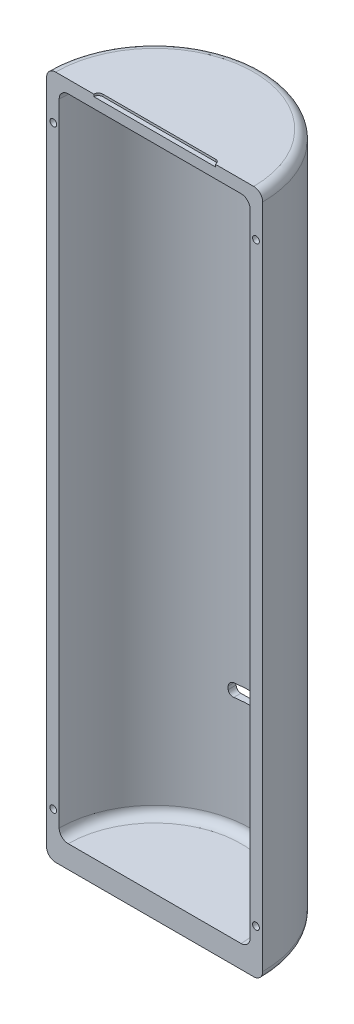
ISO-10303-21;
HEADER;
FILE_DESCRIPTION(('STEP AP214'),'2;1');
FILE_NAME('part.step','',(''),(''),'','','');
FILE_SCHEMA(('AUTOMOTIVE_DESIGN { 1 0 10303 214 1 1 1 1 }'));
ENDSEC;
DATA;
#1=APPLICATION_CONTEXT('core data for automotive mechanical design processes');
#2=APPLICATION_PROTOCOL_DEFINITION('international standard','automotive_design',2000,#1);
#3=PRODUCT_CONTEXT('',#1,'mechanical');
#4=PRODUCT('Part','Part','',(#3));
#5=PRODUCT_RELATED_PRODUCT_CATEGORY('part','',(#4));
#6=PRODUCT_DEFINITION_FORMATION('','',#4);
#7=PRODUCT_DEFINITION_CONTEXT('part definition',#1,'design');
#8=PRODUCT_DEFINITION('design','',#6,#7);
#9=PRODUCT_DEFINITION_SHAPE('','',#8);
#10=(LENGTH_UNIT() NAMED_UNIT(*) SI_UNIT(.MILLI.,.METRE.));
#11=(NAMED_UNIT(*) PLANE_ANGLE_UNIT() SI_UNIT($,.RADIAN.));
#12=(NAMED_UNIT(*) SI_UNIT($,.STERADIAN.) SOLID_ANGLE_UNIT());
#13=UNCERTAINTY_MEASURE_WITH_UNIT(LENGTH_MEASURE(1.E-05),#10,'distance_accuracy_value','');
#14=(GEOMETRIC_REPRESENTATION_CONTEXT(3) GLOBAL_UNCERTAINTY_ASSIGNED_CONTEXT((#13)) GLOBAL_UNIT_ASSIGNED_CONTEXT((#10,
#11,#12)) REPRESENTATION_CONTEXT('',''));
#15=CARTESIAN_POINT('',(0.,0.,0.));
#16=DIRECTION('',(0.,0.,1.));
#17=DIRECTION('',(1.,0.,0.));
#18=AXIS2_PLACEMENT_3D('',#15,#16,#17);
#19=CARTESIAN_POINT('',(0.,152.,0.));
#20=DIRECTION('',(0.,-1.,0.));
#21=DIRECTION('',(0.,0.,-1.));
#22=AXIS2_PLACEMENT_3D('',#19,#20,#21);
#23=CYLINDRICAL_SURFACE('',#22,21.2);
#24=CARTESIAN_POINT('',(-4.4,32.35,-20.7383702349052));
#25=CARTESIAN_POINT('',(-4.4000001515096,32.379107600653,-20.7383698433978));
#26=CARTESIAN_POINT('',(-4.3987888565949,32.408201053021,-20.7386272390488));
#27=CARTESIAN_POINT('',(-4.3939588193553,32.4661754495899,-20.7396512728291));
#28=CARTESIAN_POINT('',(-4.3903403202981,32.4950564149664,-20.7404178595004));
#29=CARTESIAN_POINT('',(-4.3759192589122,32.5809794161951,-20.743467242474));
#30=CARTESIAN_POINT('',(-4.36155096422142,32.6374389453209,-20.7464997241652));
#31=CARTESIAN_POINT('',(-4.32375391654669,32.7470787921054,-20.7544096529308));
#32=CARTESIAN_POINT('',(-4.30032314504044,32.8002583761468,-20.759287511028));
#33=CARTESIAN_POINT('',(-4.2451186797055,32.9019115053798,-20.7706465618117));
#34=CARTESIAN_POINT('',(-4.2133447143213,32.9503848973232,-20.7771278066851));
#35=CARTESIAN_POINT('',(-4.14200532283936,33.041828961603,-20.7914676209067));
#36=CARTESIAN_POINT('',(-4.1023598621572,33.0847349256314,-20.7993402384933));
#37=CARTESIAN_POINT('',(-4.01662488599776,33.163322658802,-20.8160666039073));
#38=CARTESIAN_POINT('',(-3.97053375340399,33.1990026095359,-20.8249205978304));
#39=CARTESIAN_POINT('',(-3.87223146361336,33.2628398865507,-20.8434251165478));
#40=CARTESIAN_POINT('',(-3.81991817223142,33.2908362939988,-20.8530878403309));
#41=CARTESIAN_POINT('',(-3.71138198358165,33.3376190603292,-20.8726777964638));
#42=CARTESIAN_POINT('',(-3.65516079878495,33.3564094246828,-20.8826049117933));
#43=CARTESIAN_POINT('',(-3.55725550918452,33.3801877944643,-20.8994647172685));
#44=CARTESIAN_POINT('',(-3.51614906333593,33.3876083389167,-20.9064209319152));
#45=CARTESIAN_POINT('',(-3.43337425294976,33.3975147053391,-20.9201749805508));
#46=CARTESIAN_POINT('',(-3.39170666478906,33.4000067561618,-20.9269730037113));
#47=CARTESIAN_POINT('',(-3.35,33.4,-20.9336451675288));
#48=B_SPLINE_CURVE_WITH_KNOTS('',3,(#24,#25,#26,#27,#28,#29,#30,#31,#32,#33,#34,#35,#36,#37,#38,
#39,#40,#41,#42,#43,#44,#45,#46,#47),.UNSPECIFIED.,.F.,.F.,(4,2,2,2,2,2,2,2,2,2,2,4),(0.,
0.0872684818234315,0.174528145791605,0.348640619584171,0.522791896509528,0.696948842439431,
0.872976707941943,1.04904881552733,1.22856736866758,1.40800774528996,1.53477000707225,
1.66137195834209),.UNSPECIFIED.);
#49=CARTESIAN_POINT('',(-4.4,32.35,-20.7383702349052));
#50=VERTEX_POINT('',#49);
#51=CARTESIAN_POINT('',(-3.35,33.4,-20.9336451675288));
#52=VERTEX_POINT('',#51);
#53=EDGE_CURVE('E785',#50,#52,#48,.T.);
#54=ORIENTED_EDGE('',*,*,#53,.T.);
#55=CARTESIAN_POINT('',(0.,33.4,0.));
#56=DIRECTION('',(0.,1.,0.));
#57=DIRECTION('',(0.,0.,1.));
#58=AXIS2_PLACEMENT_3D('',#55,#56,#57);
#59=CIRCLE('',#58,21.2);
#60=CARTESIAN_POINT('',(3.35,33.4,-20.9336451675288));
#61=VERTEX_POINT('',#60);
#62=EDGE_CURVE('E394',#52,#61,#59,.F.);
#63=ORIENTED_EDGE('',*,*,#62,.T.);
#64=CARTESIAN_POINT('',(3.35,33.4,-20.9336451675288));
#65=CARTESIAN_POINT('',(3.37995160542955,33.3999996171922,-20.9288523968009));
#66=CARTESIAN_POINT('',(3.40987811653389,33.3987176775791,-20.9239968936497));
#67=CARTESIAN_POINT('',(3.46949591392431,33.3936075736858,-20.9141939485621));
#68=CARTESIAN_POINT('',(3.49918721440298,33.3897795642378,-20.9092465122341));
#69=CARTESIAN_POINT('',(3.58755078993113,33.3745162887233,-20.8943301248397));
#70=CARTESIAN_POINT('',(3.64560061748393,33.3593016663017,-20.8842730100985));
#71=CARTESIAN_POINT('',(3.75828473099165,33.3192193523011,-20.8642896209136));
#72=CARTESIAN_POINT('',(3.81291756354137,33.2943475850813,-20.8543634035441));
#73=CARTESIAN_POINT('',(3.91722424166481,33.2356272404759,-20.8350226280058));
#74=CARTESIAN_POINT('',(3.96689899652127,33.2017803132615,-20.8256079761637));
#75=CARTESIAN_POINT('',(4.05975464935551,33.1260987104448,-20.8077059831843));
#76=CARTESIAN_POINT('',(4.10294883056208,33.0842807840545,-20.7992167552551));
#77=CARTESIAN_POINT('',(4.18168253527464,32.993740781101,-20.7835306664113));
#78=CARTESIAN_POINT('',(4.2172209927563,32.9450177445968,-20.7763339855011));
#79=CARTESIAN_POINT('',(4.27906635037108,32.8428023140441,-20.7636840871812));
#80=CARTESIAN_POINT('',(4.30549917346799,32.7893889711621,-20.7582071892381));
#81=CARTESIAN_POINT('',(4.34897680699255,32.6787410004115,-20.7491421067053));
#82=CARTESIAN_POINT('',(4.36602987099571,32.6215097819157,-20.7455522617558));
#83=CARTESIAN_POINT('',(4.38539018518352,32.5281928748702,-20.7414658703578));
#84=CARTESIAN_POINT('',(4.39086525883165,32.4927624224329,-20.7403067839611));
#85=CARTESIAN_POINT('',(4.39816938468507,32.4215603669354,-20.7387586603825));
#86=CARTESIAN_POINT('',(4.40000342917201,32.3857892986574,-20.738368568823));
#87=CARTESIAN_POINT('',(4.4,32.35,-20.7383702349052));
#88=B_SPLINE_CURVE_WITH_KNOTS('',3,(#64,#65,#66,#67,#68,#69,#70,#71,#72,#73,#74,#75,#76,#77,#78,
#79,#80,#81,#82,#83,#84,#85,#86,#87),.UNSPECIFIED.,.F.,.F.,(4,2,2,2,2,2,2,2,2,2,2,4),(0.,
0.0909414579116239,0.181877385978352,0.36348563802479,0.545170618331823,0.726822217204737,
0.908096243109193,1.08939549429618,1.2680761318598,1.44659928956934,1.55403000558249,
1.66131331936211),.UNSPECIFIED.);
#89=CARTESIAN_POINT('',(4.4,32.35,-20.7383702349052));
#90=VERTEX_POINT('',#89);
#91=EDGE_CURVE('E227',#61,#90,#88,.T.);
#92=ORIENTED_EDGE('',*,*,#91,.T.);
#93=DIRECTION('',(0.,-1.,0.));
#94=VECTOR('',#93,1.);
#95=CARTESIAN_POINT('',(4.39999999999999,152.,-20.7383702349052));
#96=LINE('',#95,#94);
#97=CARTESIAN_POINT('',(4.39999999999999,31.65,-20.7383702349052));
#98=VERTEX_POINT('',#97);
#99=EDGE_CURVE('E237',#90,#98,#96,.T.);
#100=ORIENTED_EDGE('',*,*,#99,.T.);
#101=CARTESIAN_POINT('',(4.4,31.65,-20.7383702349052));
#102=CARTESIAN_POINT('',(4.40000015150959,31.620892399347,-20.7383698433978));
#103=CARTESIAN_POINT('',(4.39878885659489,31.591798946979,-20.7386272390488));
#104=CARTESIAN_POINT('',(4.39395881935529,31.5338245504101,-20.7396512728291));
#105=CARTESIAN_POINT('',(4.39034032029809,31.5049435850336,-20.7404178595004));
#106=CARTESIAN_POINT('',(4.37591925891219,31.4190205838049,-20.743467242474));
#107=CARTESIAN_POINT('',(4.36155096422141,31.3625610546791,-20.7464997241653));
#108=CARTESIAN_POINT('',(4.32375391654668,31.2529212078946,-20.7544096529308));
#109=CARTESIAN_POINT('',(4.30032314504043,31.1997416238532,-20.759287511028));
#110=CARTESIAN_POINT('',(4.2451186797055,31.0980884946202,-20.7706465618117));
#111=CARTESIAN_POINT('',(4.2133447143213,31.0496151026768,-20.7771278066851));
#112=CARTESIAN_POINT('',(4.14200532283935,30.958171038397,-20.7914676209068));
#113=CARTESIAN_POINT('',(4.1023598621572,30.9152650743686,-20.7993402384933));
#114=CARTESIAN_POINT('',(4.01662488599776,30.836677341198,-20.8160666039073));
#115=CARTESIAN_POINT('',(3.97053375340399,30.8009973904641,-20.8249205978304));
#116=CARTESIAN_POINT('',(3.87223146361335,30.7371601134493,-20.8434251165478));
#117=CARTESIAN_POINT('',(3.81991817223141,30.7091637060012,-20.8530878403309));
#118=CARTESIAN_POINT('',(3.71138198358164,30.6623809396708,-20.8726777964638));
#119=CARTESIAN_POINT('',(3.65516079878495,30.6435905753172,-20.8826049117933));
#120=CARTESIAN_POINT('',(3.55725550918452,30.6198122055357,-20.8994647172685));
#121=CARTESIAN_POINT('',(3.51614906333593,30.6123916610833,-20.9064209319152));
#122=CARTESIAN_POINT('',(3.43337425294976,30.6024852946609,-20.9201749805508));
#123=CARTESIAN_POINT('',(3.39170666478906,30.5999932438382,-20.9269730037113));
#124=CARTESIAN_POINT('',(3.35,30.6,-20.9336451675288));
#125=B_SPLINE_CURVE_WITH_KNOTS('',3,(#101,#102,#103,#104,#105,#106,#107,#108,#109,#110,#111,
#112,#113,#114,#115,#116,#117,#118,#119,#120,#121,#122,#123,#124),.UNSPECIFIED.,.F.,.F.,(4,2,2,
2,2,2,2,2,2,2,2,4),(0.,0.0872684818234315,0.174528145791606,0.348640619584171,0.522791896509523,
0.696948842439424,0.872976707941937,1.04904881552733,1.22856736866758,1.40800774528996,
1.53477000707225,1.66137195834209),.UNSPECIFIED.);
#126=CARTESIAN_POINT('',(3.35,30.6,-20.9336451675288));
#127=VERTEX_POINT('',#126);
#128=EDGE_CURVE('E254',#98,#127,#125,.T.);
#129=ORIENTED_EDGE('',*,*,#128,.T.);
#130=CARTESIAN_POINT('',(0.,30.6,0.));
#131=DIRECTION('',(0.,-1.,0.));
#132=DIRECTION('',(0.,0.,-1.));
#133=AXIS2_PLACEMENT_3D('',#130,#131,#132);
#134=CIRCLE('',#133,21.2);
#135=CARTESIAN_POINT('',(-3.35,30.6,-20.9336451675288));
#136=VERTEX_POINT('',#135);
#137=EDGE_CURVE('E271',#127,#136,#134,.F.);
#138=ORIENTED_EDGE('',*,*,#137,.T.);
#139=CARTESIAN_POINT('',(-3.35,30.6,-20.9336451675288));
#140=CARTESIAN_POINT('',(-3.37995160542955,30.6000003828078,-20.9288523968009));
#141=CARTESIAN_POINT('',(-3.40987811653389,30.6012823224209,-20.9239968936497));
#142=CARTESIAN_POINT('',(-3.46949591392432,30.6063924263142,-20.9141939485621));
#143=CARTESIAN_POINT('',(-3.49918721440298,30.6102204357622,-20.9092465122341));
#144=CARTESIAN_POINT('',(-3.58755078993114,30.6254837112767,-20.8943301248397));
#145=CARTESIAN_POINT('',(-3.64560061748394,30.6406983336983,-20.8842730100985));
#146=CARTESIAN_POINT('',(-3.75828473099166,30.6807806476989,-20.8642896209136));
#147=CARTESIAN_POINT('',(-3.81291756354138,30.7056524149187,-20.8543634035441));
#148=CARTESIAN_POINT('',(-3.91722424166481,30.7643727595241,-20.8350226280058));
#149=CARTESIAN_POINT('',(-3.96689899652128,30.7982196867385,-20.8256079761637));
#150=CARTESIAN_POINT('',(-4.05975464935551,30.8739012895553,-20.8077059831843));
#151=CARTESIAN_POINT('',(-4.10294883056208,30.9157192159455,-20.7992167552551));
#152=CARTESIAN_POINT('',(-4.18168253527465,31.006259218899,-20.7835306664113));
#153=CARTESIAN_POINT('',(-4.21722099275631,31.0549822554032,-20.7763339855011));
#154=CARTESIAN_POINT('',(-4.27906635037109,31.1571976859559,-20.7636840871812));
#155=CARTESIAN_POINT('',(-4.305499173468,31.2106110288379,-20.7582071892381));
#156=CARTESIAN_POINT('',(-4.34897680699256,31.3212589995885,-20.7491421067053));
#157=CARTESIAN_POINT('',(-4.36602987099572,31.3784902180844,-20.7455522617558));
#158=CARTESIAN_POINT('',(-4.38539018518353,31.4718071251298,-20.7414658703578));
#159=CARTESIAN_POINT('',(-4.39086525883166,31.5072375775671,-20.7403067839611));
#160=CARTESIAN_POINT('',(-4.39816938468507,31.5784396330646,-20.7387586603825));
#161=CARTESIAN_POINT('',(-4.40000342917201,31.6142107013426,-20.738368568823));
#162=CARTESIAN_POINT('',(-4.4,31.65,-20.7383702349052));
#163=B_SPLINE_CURVE_WITH_KNOTS('',3,(#139,#140,#141,#142,#143,#144,#145,#146,#147,#148,#149,
#150,#151,#152,#153,#154,#155,#156,#157,#158,#159,#160,#161,#162),.UNSPECIFIED.,.F.,.F.,(4,2,2,
2,2,2,2,2,2,2,2,4),(0.,0.0909414579116234,0.181877385978351,0.363485638024791,0.545170618331821,
0.726822217204738,0.908096243109195,1.08939549429618,1.2680761318598,1.44659928956935,
1.55403000558249,1.66131331936211),.UNSPECIFIED.);
#164=CARTESIAN_POINT('',(-4.4,31.65,-20.7383702349052));
#165=VERTEX_POINT('',#164);
#166=EDGE_CURVE('E262',#136,#165,#163,.T.);
#167=ORIENTED_EDGE('',*,*,#166,.T.);
#168=DIRECTION('',(0.,-1.,0.));
#169=VECTOR('',#168,1.);
#170=CARTESIAN_POINT('',(-4.4,152.,-20.7383702349052));
#171=LINE('',#170,#169);
#172=EDGE_CURVE('E270',#165,#50,#171,.F.);
#173=ORIENTED_EDGE('',*,*,#172,.T.);
#174=EDGE_LOOP('',(#54,#63,#92,#100,#129,#138,#167,#173));
#175=FACE_BOUND('',#174,.T.);
#176=DIRECTION('',(0.,-1.,0.));
#177=VECTOR('',#176,1.);
#178=CARTESIAN_POINT('',(21.2,152.,0.));
#179=LINE('',#178,#177);
#180=CARTESIAN_POINT('',(21.2,147.2,0.));
#181=VERTEX_POINT('',#180);
#182=CARTESIAN_POINT('',(21.2,7.00000000000001,0.));
#183=VERTEX_POINT('',#182);
#184=EDGE_CURVE('E413',#181,#183,#179,.T.);
#185=ORIENTED_EDGE('',*,*,#184,.F.);
#186=CARTESIAN_POINT('',(0.,147.2,0.));
#187=DIRECTION('',(0.,1.,0.));
#188=DIRECTION('',(0.,0.,1.));
#189=AXIS2_PLACEMENT_3D('',#186,#187,#188);
#190=CIRCLE('',#189,21.2);
#191=CARTESIAN_POINT('',(-21.2,147.2,0.));
#192=VERTEX_POINT('',#191);
#193=EDGE_CURVE('E341',#181,#192,#190,.T.);
#194=ORIENTED_EDGE('',*,*,#193,.T.);
#195=DIRECTION('',(0.,-1.,0.));
#196=VECTOR('',#195,1.);
#197=CARTESIAN_POINT('',(-21.2,152.,0.));
#198=LINE('',#197,#196);
#199=CARTESIAN_POINT('',(-21.2,7.00000000000001,0.));
#200=VERTEX_POINT('',#199);
#201=EDGE_CURVE('E421',#200,#192,#198,.F.);
#202=ORIENTED_EDGE('',*,*,#201,.F.);
#203=CARTESIAN_POINT('',(0.,7.00000000000001,0.));
#204=DIRECTION('',(0.,1.,0.));
#205=DIRECTION('',(0.,0.,1.));
#206=AXIS2_PLACEMENT_3D('',#203,#204,#205);
#207=CIRCLE('',#206,21.2);
#208=EDGE_CURVE('E332',#200,#183,#207,.F.);
#209=ORIENTED_EDGE('',*,*,#208,.T.);
#210=EDGE_LOOP('',(#185,#194,#202,#209));
#211=FACE_BOUND('',#210,.T.);
#212=ADVANCED_FACE('F38',(#175,#211),#23,.F.);
#213=CARTESIAN_POINT('',(0.,149.2,0.));
#214=DIRECTION('',(0.,1.,0.));
#215=DIRECTION('',(0.,0.,1.));
#216=AXIS2_PLACEMENT_3D('',#213,#214,#215);
#217=PLANE('',#216);
#218=CARTESIAN_POINT('',(0.,149.2,0.));
#219=DIRECTION('',(0.,1.,0.));
#220=DIRECTION('',(0.,0.,1.));
#221=AXIS2_PLACEMENT_3D('',#218,#219,#220);
#222=CIRCLE('',#221,19.2);
#223=CARTESIAN_POINT('',(-19.2,149.2,0.));
#224=VERTEX_POINT('',#223);
#225=CARTESIAN_POINT('',(19.2,149.2,0.));
#226=VERTEX_POINT('',#225);
#227=EDGE_CURVE('E340',#224,#226,#222,.F.);
#228=ORIENTED_EDGE('',*,*,#227,.T.);
#229=DIRECTION('',(-1.,0.,0.));
#230=VECTOR('',#229,1.);
#231=CARTESIAN_POINT('',(0.,149.2,0.));
#232=LINE('',#231,#230);
#233=EDGE_CURVE('E409',#226,#224,#232,.T.);
#234=ORIENTED_EDGE('',*,*,#233,.T.);
#235=EDGE_LOOP('',(#228,#234));
#236=FACE_BOUND('',#235,.T.);
#237=ADVANCED_FACE('F293',(#236),#217,.F.);
#238=CARTESIAN_POINT('',(0.,5.,0.));
#239=DIRECTION('',(0.,1.,0.));
#240=DIRECTION('',(0.,0.,1.));
#241=AXIS2_PLACEMENT_3D('',#238,#239,#240);
#242=PLANE('',#241);
#243=DIRECTION('',(-1.,0.,0.));
#244=VECTOR('',#243,1.);
#245=CARTESIAN_POINT('',(0.,5.,0.));
#246=LINE('',#245,#244);
#247=CARTESIAN_POINT('',(19.2,5.,0.));
#248=VERTEX_POINT('',#247);
#249=CARTESIAN_POINT('',(-19.2,5.,0.));
#250=VERTEX_POINT('',#249);
#251=EDGE_CURVE('E418',#248,#250,#246,.T.);
#252=ORIENTED_EDGE('',*,*,#251,.F.);
#253=CARTESIAN_POINT('',(0.,5.,0.));
#254=DIRECTION('',(0.,1.,0.));
#255=DIRECTION('',(0.,0.,1.));
#256=AXIS2_PLACEMENT_3D('',#253,#254,#255);
#257=CIRCLE('',#256,19.2);
#258=EDGE_CURVE('E349',#248,#250,#257,.T.);
#259=ORIENTED_EDGE('',*,*,#258,.T.);
#260=EDGE_LOOP('',(#252,#259));
#261=FACE_BOUND('',#260,.T.);
#262=ADVANCED_FACE('F299',(#261),#242,.T.);
#263=CARTESIAN_POINT('',(0.,7.00000000000001,0.));
#264=DIRECTION('',(0.,1.,0.));
#265=DIRECTION('',(0.,0.,1.));
#266=AXIS2_PLACEMENT_3D('',#263,#264,#265);
#267=TOROIDAL_SURFACE('',#266,19.2,2.);
#268=ORIENTED_EDGE('',*,*,#208,.F.);
#269=CARTESIAN_POINT('',(-19.2,7.00000000000001,0.));
#270=DIRECTION('',(0.,0.,-1.));
#271=DIRECTION('',(-1.,0.,0.));
#272=AXIS2_PLACEMENT_3D('',#269,#270,#271);
#273=CIRCLE('',#272,2.);
#274=EDGE_CURVE('E334',#200,#250,#273,.F.);
#275=ORIENTED_EDGE('',*,*,#274,.T.);
#276=ORIENTED_EDGE('',*,*,#258,.F.);
#277=CARTESIAN_POINT('',(19.2,7.00000000000001,0.));
#278=DIRECTION('',(0.,0.,-1.));
#279=DIRECTION('',(-1.,0.,0.));
#280=AXIS2_PLACEMENT_3D('',#277,#278,#279);
#281=CIRCLE('',#280,2.);
#282=EDGE_CURVE('E336',#248,#183,#281,.F.);
#283=ORIENTED_EDGE('',*,*,#282,.T.);
#284=EDGE_LOOP('',(#268,#275,#276,#283));
#285=FACE_BOUND('',#284,.T.);
#286=ADVANCED_FACE('F310',(#285),#267,.F.);
#287=CARTESIAN_POINT('',(0.,147.2,0.));
#288=DIRECTION('',(0.,1.,0.));
#289=DIRECTION('',(0.,0.,1.));
#290=AXIS2_PLACEMENT_3D('',#287,#288,#289);
#291=TOROIDAL_SURFACE('',#290,19.2,2.);
#292=ORIENTED_EDGE('',*,*,#227,.F.);
#293=CARTESIAN_POINT('',(-19.2,147.2,0.));
#294=DIRECTION('',(0.,0.,-1.));
#295=DIRECTION('',(-1.,0.,0.));
#296=AXIS2_PLACEMENT_3D('',#293,#294,#295);
#297=CIRCLE('',#296,2.);
#298=EDGE_CURVE('E356',#224,#192,#297,.F.);
#299=ORIENTED_EDGE('',*,*,#298,.T.);
#300=ORIENTED_EDGE('',*,*,#193,.F.);
#301=CARTESIAN_POINT('',(19.2,147.2,0.));
#302=DIRECTION('',(0.,0.,-1.));
#303=DIRECTION('',(-1.,0.,0.));
#304=AXIS2_PLACEMENT_3D('',#301,#302,#303);
#305=CIRCLE('',#304,2.);
#306=EDGE_CURVE('E346',#181,#226,#305,.F.);
#307=ORIENTED_EDGE('',*,*,#306,.T.);
#308=EDGE_LOOP('',(#292,#299,#300,#307));
#309=FACE_BOUND('',#308,.T.);
#310=ADVANCED_FACE('F40',(#309),#291,.F.);
#311=CARTESIAN_POINT('',(0.,0.,0.));
#312=DIRECTION('',(0.,0.,-1.));
#313=DIRECTION('',(-1.,0.,0.));
#314=AXIS2_PLACEMENT_3D('',#311,#312,#313);
#315=PLANE('',#314);
#316=CARTESIAN_POINT('',(22.499999999999,142.,0.));
#317=DIRECTION('',(0.,0.,1.));
#318=DIRECTION('',(-1.,0.,0.));
#319=AXIS2_PLACEMENT_3D('',#316,#317,#318);
#320=CIRCLE('',#319,0.750000000000002);
#321=CARTESIAN_POINT('',(21.749999999999,142.,0.));
#322=VERTEX_POINT('',#321);
#323=EDGE_CURVE('E503',#322,#322,#320,.T.);
#324=ORIENTED_EDGE('',*,*,#323,.F.);
#325=EDGE_LOOP('',(#324));
#326=FACE_BOUND('',#325,.T.);
#327=CARTESIAN_POINT('',(22.5,10.,0.));
#328=DIRECTION('',(0.,0.,1.));
#329=DIRECTION('',(-1.,0.,0.));
#330=AXIS2_PLACEMENT_3D('',#327,#328,#329);
#331=CIRCLE('',#330,0.750000000000068);
#332=CARTESIAN_POINT('',(21.7499999999999,10.,0.));
#333=VERTEX_POINT('',#332);
#334=EDGE_CURVE('E511',#333,#333,#331,.T.);
#335=ORIENTED_EDGE('',*,*,#334,.F.);
#336=EDGE_LOOP('',(#335));
#337=FACE_BOUND('',#336,.T.);
#338=CARTESIAN_POINT('',(-22.5,10.,0.));
#339=DIRECTION('',(0.,0.,1.));
#340=DIRECTION('',(1.,0.,0.));
#341=AXIS2_PLACEMENT_3D('',#338,#339,#340);
#342=CIRCLE('',#341,0.750000000000002);
#343=CARTESIAN_POINT('',(-21.75,10.,0.));
#344=VERTEX_POINT('',#343);
#345=EDGE_CURVE('E519',#344,#344,#342,.T.);
#346=ORIENTED_EDGE('',*,*,#345,.F.);
#347=EDGE_LOOP('',(#346));
#348=FACE_BOUND('',#347,.T.);
#349=CARTESIAN_POINT('',(-22.5,142.,0.));
#350=DIRECTION('',(0.,0.,1.));
#351=DIRECTION('',(1.,0.,0.));
#352=AXIS2_PLACEMENT_3D('',#349,#350,#351);
#353=CIRCLE('',#352,0.750000000000002);
#354=CARTESIAN_POINT('',(-21.75,142.,0.));
#355=VERTEX_POINT('',#354);
#356=EDGE_CURVE('E495',#355,#355,#353,.T.);
#357=ORIENTED_EDGE('',*,*,#356,.F.);
#358=EDGE_LOOP('',(#357));
#359=FACE_BOUND('',#358,.T.);
#360=DIRECTION('',(1.,0.,0.));
#361=VECTOR('',#360,1.);
#362=CARTESIAN_POINT('',(0.,151.5,0.));
#363=LINE('',#362,#361);
#364=CARTESIAN_POINT('',(-13.5,151.5,0.));
#365=VERTEX_POINT('',#364);
#366=CARTESIAN_POINT('',(13.5,151.5,0.));
#367=VERTEX_POINT('',#366);
#368=EDGE_CURVE('E11',#365,#367,#363,.T.);
#369=ORIENTED_EDGE('',*,*,#368,.F.);
#370=DIRECTION('',(0.,1.,0.));
#371=VECTOR('',#370,1.);
#372=CARTESIAN_POINT('',(-13.5,151.5,0.));
#373=LINE('',#372,#371);
#374=CARTESIAN_POINT('',(-13.5,152.,0.));
#375=VERTEX_POINT('',#374);
#376=EDGE_CURVE('E223',#365,#375,#373,.T.);
#377=ORIENTED_EDGE('',*,*,#376,.T.);
#378=DIRECTION('',(-1.,0.,0.));
#379=VECTOR('',#378,1.);
#380=CARTESIAN_POINT('',(-24.,152.,0.));
#381=LINE('',#380,#379);
#382=CARTESIAN_POINT('',(-22.,152.,0.));
#383=VERTEX_POINT('',#382);
#384=EDGE_CURVE('E404',#375,#383,#381,.T.);
#385=ORIENTED_EDGE('',*,*,#384,.T.);
#386=CARTESIAN_POINT('',(-22.,150.,0.));
#387=DIRECTION('',(0.,0.,-1.));
#388=DIRECTION('',(-1.,0.,0.));
#389=AXIS2_PLACEMENT_3D('',#386,#387,#388);
#390=CIRCLE('',#389,2.);
#391=CARTESIAN_POINT('',(-24.,150.,0.));
#392=VERTEX_POINT('',#391);
#393=EDGE_CURVE('E435',#383,#392,#390,.F.);
#394=ORIENTED_EDGE('',*,*,#393,.T.);
#395=DIRECTION('',(0.,-1.,0.));
#396=VECTOR('',#395,1.);
#397=CARTESIAN_POINT('',(-24.,0.,0.));
#398=LINE('',#397,#396);
#399=CARTESIAN_POINT('',(-24.,2.,0.));
#400=VERTEX_POINT('',#399);
#401=EDGE_CURVE('E387',#392,#400,#398,.T.);
#402=ORIENTED_EDGE('',*,*,#401,.T.);
#403=CARTESIAN_POINT('',(-22.,2.,0.));
#404=DIRECTION('',(0.,0.,-1.));
#405=DIRECTION('',(-1.,0.,0.));
#406=AXIS2_PLACEMENT_3D('',#403,#404,#405);
#407=CIRCLE('',#406,2.);
#408=CARTESIAN_POINT('',(-22.,0.,0.));
#409=VERTEX_POINT('',#408);
#410=EDGE_CURVE('E429',#400,#409,#407,.F.);
#411=ORIENTED_EDGE('',*,*,#410,.T.);
#412=DIRECTION('',(1.,0.,0.));
#413=VECTOR('',#412,1.);
#414=CARTESIAN_POINT('',(-24.,0.,0.));
#415=LINE('',#414,#413);
#416=CARTESIAN_POINT('',(22.,0.,0.));
#417=VERTEX_POINT('',#416);
#418=EDGE_CURVE('E392',#409,#417,#415,.T.);
#419=ORIENTED_EDGE('',*,*,#418,.T.);
#420=CARTESIAN_POINT('',(22.,2.,0.));
#421=DIRECTION('',(0.,0.,-1.));
#422=DIRECTION('',(-1.,0.,0.));
#423=AXIS2_PLACEMENT_3D('',#420,#421,#422);
#424=CIRCLE('',#423,2.);
#425=CARTESIAN_POINT('',(24.,2.,0.));
#426=VERTEX_POINT('',#425);
#427=EDGE_CURVE('E426',#417,#426,#424,.F.);
#428=ORIENTED_EDGE('',*,*,#427,.T.);
#429=DIRECTION('',(0.,1.,0.));
#430=VECTOR('',#429,1.);
#431=CARTESIAN_POINT('',(24.,0.,0.));
#432=LINE('',#431,#430);
#433=CARTESIAN_POINT('',(24.,150.,0.));
#434=VERTEX_POINT('',#433);
#435=EDGE_CURVE('E401',#426,#434,#432,.T.);
#436=ORIENTED_EDGE('',*,*,#435,.T.);
#437=CARTESIAN_POINT('',(22.,150.,0.));
#438=DIRECTION('',(0.,0.,-1.));
#439=DIRECTION('',(-1.,0.,0.));
#440=AXIS2_PLACEMENT_3D('',#437,#438,#439);
#441=CIRCLE('',#440,2.);
#442=CARTESIAN_POINT('',(22.,152.,0.));
#443=VERTEX_POINT('',#442);
#444=EDGE_CURVE('E432',#434,#443,#441,.F.);
#445=ORIENTED_EDGE('',*,*,#444,.T.);
#446=CARTESIAN_POINT('',(13.5,152.,0.));
#447=VERTEX_POINT('',#446);
#448=EDGE_CURVE('E405',#443,#447,#381,.T.);
#449=ORIENTED_EDGE('',*,*,#448,.T.);
#450=DIRECTION('',(0.,1.,0.));
#451=VECTOR('',#450,1.);
#452=CARTESIAN_POINT('',(13.5,151.5,0.));
#453=LINE('',#452,#451);
#454=EDGE_CURVE('E54',#447,#367,#453,.F.);
#455=ORIENTED_EDGE('',*,*,#454,.T.);
#456=EDGE_LOOP('',(#369,#377,#385,#394,#402,#411,#419,#428,#436,#445,#449,#455));
#457=FACE_BOUND('',#456,.T.);
#458=ORIENTED_EDGE('',*,*,#201,.T.);
#459=ORIENTED_EDGE('',*,*,#298,.F.);
#460=ORIENTED_EDGE('',*,*,#233,.F.);
#461=ORIENTED_EDGE('',*,*,#306,.F.);
#462=ORIENTED_EDGE('',*,*,#184,.T.);
#463=ORIENTED_EDGE('',*,*,#282,.F.);
#464=ORIENTED_EDGE('',*,*,#251,.T.);
#465=ORIENTED_EDGE('',*,*,#274,.F.);
#466=EDGE_LOOP('',(#458,#459,#460,#461,#462,#463,#464,#465));
#467=FACE_BOUND('',#466,.T.);
#468=ADVANCED_FACE('F326',(#326,#337,#348,#359,#457,#467),#315,.F.);
#469=CARTESIAN_POINT('',(0.,152.,0.));
#470=DIRECTION('',(0.,-1.,0.));
#471=DIRECTION('',(0.,0.,-1.));
#472=AXIS2_PLACEMENT_3D('',#469,#470,#471);
#473=CYLINDRICAL_SURFACE('',#472,24.);
#474=DIRECTION('',(0.,-1.,0.));
#475=VECTOR('',#474,1.);
#476=CARTESIAN_POINT('',(8.35164654424504,152.,-22.5));
#477=LINE('',#476,#475);
#478=CARTESIAN_POINT('',(8.35164654424504,29.25,-22.5));
#479=VERTEX_POINT('',#478);
#480=CARTESIAN_POINT('',(8.35164654424504,34.75,-22.5));
#481=VERTEX_POINT('',#480);
#482=EDGE_CURVE('E363',#479,#481,#477,.F.);
#483=ORIENTED_EDGE('',*,*,#482,.T.);
#484=CARTESIAN_POINT('',(0.,34.75,0.));
#485=DIRECTION('',(0.,1.,0.));
#486=DIRECTION('',(0.,0.,1.));
#487=AXIS2_PLACEMENT_3D('',#484,#485,#486);
#488=CIRCLE('',#487,24.);
#489=CARTESIAN_POINT('',(-8.35164654424504,34.75,-22.5));
#490=VERTEX_POINT('',#489);
#491=EDGE_CURVE('E371',#481,#490,#488,.T.);
#492=ORIENTED_EDGE('',*,*,#491,.T.);
#493=DIRECTION('',(0.,-1.,0.));
#494=VECTOR('',#493,1.);
#495=CARTESIAN_POINT('',(-8.35164654424504,152.,-22.5));
#496=LINE('',#495,#494);
#497=CARTESIAN_POINT('',(-8.35164654424504,29.25,-22.5));
#498=VERTEX_POINT('',#497);
#499=EDGE_CURVE('E367',#490,#498,#496,.T.);
#500=ORIENTED_EDGE('',*,*,#499,.T.);
#501=CARTESIAN_POINT('',(0.,29.25,0.));
#502=DIRECTION('',(0.,-1.,0.));
#503=DIRECTION('',(0.,0.,-1.));
#504=AXIS2_PLACEMENT_3D('',#501,#502,#503);
#505=CIRCLE('',#504,24.);
#506=EDGE_CURVE('E360',#498,#479,#505,.T.);
#507=ORIENTED_EDGE('',*,*,#506,.T.);
#508=EDGE_LOOP('',(#483,#492,#500,#507));
#509=FACE_BOUND('',#508,.T.);
#510=CARTESIAN_POINT('',(0.,150.,0.));
#511=DIRECTION('',(0.,1.,0.));
#512=DIRECTION('',(0.,0.,1.));
#513=AXIS2_PLACEMENT_3D('',#510,#511,#512);
#514=CIRCLE('',#513,24.);
#515=EDGE_CURVE('E438',#392,#434,#514,.F.);
#516=ORIENTED_EDGE('',*,*,#515,.T.);
#517=ORIENTED_EDGE('',*,*,#435,.F.);
#518=CARTESIAN_POINT('',(0.,2.,0.));
#519=DIRECTION('',(0.,1.,0.));
#520=DIRECTION('',(0.,0.,1.));
#521=AXIS2_PLACEMENT_3D('',#518,#519,#520);
#522=CIRCLE('',#521,24.);
#523=EDGE_CURVE('E442',#426,#400,#522,.T.);
#524=ORIENTED_EDGE('',*,*,#523,.T.);
#525=ORIENTED_EDGE('',*,*,#401,.F.);
#526=EDGE_LOOP('',(#516,#517,#524,#525));
#527=FACE_BOUND('',#526,.T.);
#528=ADVANCED_FACE('F305',(#509,#527),#473,.T.);
#529=CARTESIAN_POINT('',(0.,152.,0.));
#530=DIRECTION('',(0.,1.,0.));
#531=DIRECTION('',(0.,0.,1.));
#532=AXIS2_PLACEMENT_3D('',#529,#530,#531);
#533=PLANE('',#532);
#534=CARTESIAN_POINT('',(-12.5,152.,0.));
#535=DIRECTION('',(0.,1.,0.));
#536=DIRECTION('',(0.,0.,1.));
#537=AXIS2_PLACEMENT_3D('',#534,#535,#536);
#538=CIRCLE('',#537,1.);
#539=CARTESIAN_POINT('',(-12.5,152.,-1.));
#540=VERTEX_POINT('',#539);
#541=EDGE_CURVE('E212',#540,#375,#538,.T.);
#542=ORIENTED_EDGE('',*,*,#541,.F.);
#543=DIRECTION('',(-1.,0.,0.));
#544=VECTOR('',#543,1.);
#545=CARTESIAN_POINT('',(-12.5,152.,-1.));
#546=LINE('',#545,#544);
#547=CARTESIAN_POINT('',(12.5,152.,-1.00000000000001));
#548=VERTEX_POINT('',#547);
#549=EDGE_CURVE('E215',#548,#540,#546,.T.);
#550=ORIENTED_EDGE('',*,*,#549,.F.);
#551=CARTESIAN_POINT('',(12.5,152.,0.));
#552=DIRECTION('',(0.,1.,0.));
#553=DIRECTION('',(0.,0.,1.));
#554=AXIS2_PLACEMENT_3D('',#551,#552,#553);
#555=CIRCLE('',#554,1.);
#556=EDGE_CURVE('E47',#447,#548,#555,.T.);
#557=ORIENTED_EDGE('',*,*,#556,.F.);
#558=ORIENTED_EDGE('',*,*,#448,.F.);
#559=CARTESIAN_POINT('',(0.,152.,0.));
#560=DIRECTION('',(0.,1.,0.));
#561=DIRECTION('',(0.,0.,1.));
#562=AXIS2_PLACEMENT_3D('',#559,#560,#561);
#563=CIRCLE('',#562,22.);
#564=EDGE_CURVE('E450',#443,#383,#563,.T.);
#565=ORIENTED_EDGE('',*,*,#564,.T.);
#566=ORIENTED_EDGE('',*,*,#384,.F.);
#567=EDGE_LOOP('',(#542,#550,#557,#558,#565,#566));
#568=FACE_BOUND('',#567,.T.);
#569=ADVANCED_FACE('F464',(#568),#533,.T.);
#570=CARTESIAN_POINT('',(0.,0.,0.));
#571=DIRECTION('',(0.,1.,0.));
#572=DIRECTION('',(0.,0.,1.));
#573=AXIS2_PLACEMENT_3D('',#570,#571,#572);
#574=PLANE('',#573);
#575=CARTESIAN_POINT('',(0.,0.,0.));
#576=DIRECTION('',(0.,1.,0.));
#577=DIRECTION('',(0.,0.,1.));
#578=AXIS2_PLACEMENT_3D('',#575,#576,#577);
#579=CIRCLE('',#578,22.);
#580=EDGE_CURVE('E446',#409,#417,#579,.F.);
#581=ORIENTED_EDGE('',*,*,#580,.T.);
#582=ORIENTED_EDGE('',*,*,#418,.F.);
#583=EDGE_LOOP('',(#581,#582));
#584=FACE_BOUND('',#583,.T.);
#585=ADVANCED_FACE('F316',(#584),#574,.F.);
#586=CARTESIAN_POINT('',(0.,150.,0.));
#587=DIRECTION('',(0.,1.,0.));
#588=DIRECTION('',(0.,0.,1.));
#589=AXIS2_PLACEMENT_3D('',#586,#587,#588);
#590=TOROIDAL_SURFACE('',#589,22.,2.);
#591=ORIENTED_EDGE('',*,*,#393,.F.);
#592=ORIENTED_EDGE('',*,*,#564,.F.);
#593=ORIENTED_EDGE('',*,*,#444,.F.);
#594=ORIENTED_EDGE('',*,*,#515,.F.);
#595=EDGE_LOOP('',(#591,#592,#593,#594));
#596=FACE_BOUND('',#595,.T.);
#597=ADVANCED_FACE('F312',(#596),#590,.T.);
#598=CARTESIAN_POINT('',(0.,2.,0.));
#599=DIRECTION('',(0.,1.,0.));
#600=DIRECTION('',(0.,0.,1.));
#601=AXIS2_PLACEMENT_3D('',#598,#599,#600);
#602=TOROIDAL_SURFACE('',#601,22.,2.);
#603=ORIENTED_EDGE('',*,*,#410,.F.);
#604=ORIENTED_EDGE('',*,*,#523,.F.);
#605=ORIENTED_EDGE('',*,*,#427,.F.);
#606=ORIENTED_EDGE('',*,*,#580,.F.);
#607=EDGE_LOOP('',(#603,#604,#605,#606));
#608=FACE_BOUND('',#607,.T.);
#609=ADVANCED_FACE('F315',(#608),#602,.T.);
#610=CARTESIAN_POINT('',(-74.,34.75,-22.5));
#611=DIRECTION('',(0.,0.,1.));
#612=DIRECTION('',(1.,0.,0.));
#613=AXIS2_PLACEMENT_3D('',#610,#611,#612);
#614=PLANE('',#613);
#615=DIRECTION('',(1.,0.,0.));
#616=VECTOR('',#615,1.);
#617=CARTESIAN_POINT('',(3.35,33.4,-22.5));
#618=LINE('',#617,#616);
#619=CARTESIAN_POINT('',(-3.35000000000001,33.4,-22.5));
#620=VERTEX_POINT('',#619);
#621=CARTESIAN_POINT('',(3.35,33.4,-22.5));
#622=VERTEX_POINT('',#621);
#623=EDGE_CURVE('E795',#620,#622,#618,.T.);
#624=ORIENTED_EDGE('',*,*,#623,.F.);
#625=CARTESIAN_POINT('',(-3.35,32.35,-22.5));
#626=DIRECTION('',(0.,0.,-1.));
#627=DIRECTION('',(1.,0.,0.));
#628=AXIS2_PLACEMENT_3D('',#625,#626,#627);
#629=CIRCLE('',#628,1.05);
#630=CARTESIAN_POINT('',(-4.4,32.35,-22.5));
#631=VERTEX_POINT('',#630);
#632=EDGE_CURVE('E792',#631,#620,#629,.T.);
#633=ORIENTED_EDGE('',*,*,#632,.F.);
#634=DIRECTION('',(0.,1.,0.));
#635=VECTOR('',#634,1.);
#636=CARTESIAN_POINT('',(-4.4,31.65,-22.5));
#637=LINE('',#636,#635);
#638=CARTESIAN_POINT('',(-4.4,31.65,-22.5));
#639=VERTEX_POINT('',#638);
#640=EDGE_CURVE('E818',#639,#631,#637,.T.);
#641=ORIENTED_EDGE('',*,*,#640,.F.);
#642=CARTESIAN_POINT('',(-3.35,31.65,-22.5));
#643=DIRECTION('',(0.,0.,-1.));
#644=DIRECTION('',(1.,0.,0.));
#645=AXIS2_PLACEMENT_3D('',#642,#643,#644);
#646=CIRCLE('',#645,1.05);
#647=CARTESIAN_POINT('',(-3.35,30.6,-22.5));
#648=VERTEX_POINT('',#647);
#649=EDGE_CURVE('E814',#648,#639,#646,.T.);
#650=ORIENTED_EDGE('',*,*,#649,.F.);
#651=DIRECTION('',(-1.,0.,0.));
#652=VECTOR('',#651,1.);
#653=CARTESIAN_POINT('',(3.35,30.6,-22.5));
#654=LINE('',#653,#652);
#655=CARTESIAN_POINT('',(3.35,30.6,-22.5));
#656=VERTEX_POINT('',#655);
#657=EDGE_CURVE('E810',#656,#648,#654,.T.);
#658=ORIENTED_EDGE('',*,*,#657,.F.);
#659=CARTESIAN_POINT('',(3.35,31.65,-22.5));
#660=DIRECTION('',(0.,0.,-1.));
#661=DIRECTION('',(-1.,0.,0.));
#662=AXIS2_PLACEMENT_3D('',#659,#660,#661);
#663=CIRCLE('',#662,1.05);
#664=CARTESIAN_POINT('',(4.4,31.65,-22.5));
#665=VERTEX_POINT('',#664);
#666=EDGE_CURVE('E806',#665,#656,#663,.T.);
#667=ORIENTED_EDGE('',*,*,#666,.F.);
#668=DIRECTION('',(0.,-1.,0.));
#669=VECTOR('',#668,1.);
#670=CARTESIAN_POINT('',(4.4,31.65,-22.5));
#671=LINE('',#670,#669);
#672=CARTESIAN_POINT('',(4.4,32.35,-22.5));
#673=VERTEX_POINT('',#672);
#674=EDGE_CURVE('E802',#673,#665,#671,.T.);
#675=ORIENTED_EDGE('',*,*,#674,.F.);
#676=CARTESIAN_POINT('',(3.35,32.35,-22.5));
#677=DIRECTION('',(0.,0.,-1.));
#678=DIRECTION('',(1.,0.,0.));
#679=AXIS2_PLACEMENT_3D('',#676,#677,#678);
#680=CIRCLE('',#679,1.05);
#681=EDGE_CURVE('E798',#622,#673,#680,.T.);
#682=ORIENTED_EDGE('',*,*,#681,.F.);
#683=EDGE_LOOP('',(#624,#633,#641,#650,#658,#667,#675,#682));
#684=FACE_BOUND('',#683,.T.);
#685=DIRECTION('',(1.,0.,0.));
#686=VECTOR('',#685,1.);
#687=CARTESIAN_POINT('',(-74.,34.75,-22.5));
#688=LINE('',#687,#686);
#689=EDGE_CURVE('E382',#490,#481,#688,.T.);
#690=ORIENTED_EDGE('',*,*,#689,.T.);
#691=ORIENTED_EDGE('',*,*,#482,.F.);
#692=DIRECTION('',(1.,0.,0.));
#693=VECTOR('',#692,1.);
#694=CARTESIAN_POINT('',(-74.,29.25,-22.5));
#695=LINE('',#694,#693);
#696=EDGE_CURVE('E388',#498,#479,#695,.T.);
#697=ORIENTED_EDGE('',*,*,#696,.F.);
#698=ORIENTED_EDGE('',*,*,#499,.F.);
#699=EDGE_LOOP('',(#690,#691,#697,#698));
#700=FACE_BOUND('',#699,.T.);
#701=ADVANCED_FACE('F319',(#684,#700),#614,.F.);
#702=CARTESIAN_POINT('',(-74.,34.75,-22.5));
#703=DIRECTION('',(0.,1.,0.));
#704=DIRECTION('',(0.,0.,1.));
#705=AXIS2_PLACEMENT_3D('',#702,#703,#704);
#706=PLANE('',#705);
#707=ORIENTED_EDGE('',*,*,#689,.F.);
#708=ORIENTED_EDGE('',*,*,#491,.F.);
#709=EDGE_LOOP('',(#707,#708));
#710=FACE_BOUND('',#709,.T.);
#711=ADVANCED_FACE('F381',(#710),#706,.F.);
#712=CARTESIAN_POINT('',(-74.,29.25,-22.5));
#713=DIRECTION('',(0.,-1.,0.));
#714=DIRECTION('',(0.,0.,-1.));
#715=AXIS2_PLACEMENT_3D('',#712,#713,#714);
#716=PLANE('',#715);
#717=ORIENTED_EDGE('',*,*,#506,.F.);
#718=ORIENTED_EDGE('',*,*,#696,.T.);
#719=EDGE_LOOP('',(#717,#718));
#720=FACE_BOUND('',#719,.T.);
#721=ADVANCED_FACE('F614',(#720),#716,.F.);
#722=CARTESIAN_POINT('',(-3.35,32.35,0.001000000000001));
#723=DIRECTION('',(0.,0.,-1.));
#724=DIRECTION('',(-1.,0.,0.));
#725=AXIS2_PLACEMENT_3D('',#722,#723,#724);
#726=CYLINDRICAL_SURFACE('',#725,1.05);
#727=DIRECTION('',(0.,0.,-1.));
#728=VECTOR('',#727,1.);
#729=CARTESIAN_POINT('',(-4.4,32.35,0.001000000000001));
#730=LINE('',#729,#728);
#731=EDGE_CURVE('E823',#50,#631,#730,.T.);
#732=ORIENTED_EDGE('',*,*,#731,.T.);
#733=ORIENTED_EDGE('',*,*,#632,.T.);
#734=DIRECTION('',(0.,0.,-1.));
#735=VECTOR('',#734,1.);
#736=CARTESIAN_POINT('',(-3.35,33.4,0.001000000000001));
#737=LINE('',#736,#735);
#738=EDGE_CURVE('E822',#52,#620,#737,.T.);
#739=ORIENTED_EDGE('',*,*,#738,.F.);
#740=ORIENTED_EDGE('',*,*,#53,.F.);
#741=EDGE_LOOP('',(#732,#733,#739,#740));
#742=FACE_BOUND('',#741,.T.);
#743=ADVANCED_FACE('F605',(#742),#726,.F.);
#744=CARTESIAN_POINT('',(-4.4,31.65,0.001000000000001));
#745=DIRECTION('',(-1.,0.,0.));
#746=DIRECTION('',(0.,0.,1.));
#747=AXIS2_PLACEMENT_3D('',#744,#745,#746);
#748=PLANE('',#747);
#749=DIRECTION('',(0.,0.,-1.));
#750=VECTOR('',#749,1.);
#751=CARTESIAN_POINT('',(-4.4,31.65,0.001000000000001));
#752=LINE('',#751,#750);
#753=EDGE_CURVE('E826',#165,#639,#752,.T.);
#754=ORIENTED_EDGE('',*,*,#753,.T.);
#755=ORIENTED_EDGE('',*,*,#640,.T.);
#756=ORIENTED_EDGE('',*,*,#731,.F.);
#757=ORIENTED_EDGE('',*,*,#172,.F.);
#758=EDGE_LOOP('',(#754,#755,#756,#757));
#759=FACE_BOUND('',#758,.T.);
#760=ADVANCED_FACE('F248',(#759),#748,.F.);
#761=CARTESIAN_POINT('',(-3.35,31.65,0.001000000000001));
#762=DIRECTION('',(0.,0.,-1.));
#763=DIRECTION('',(-1.,0.,0.));
#764=AXIS2_PLACEMENT_3D('',#761,#762,#763);
#765=CYLINDRICAL_SURFACE('',#764,1.05);
#766=DIRECTION('',(0.,0.,-1.));
#767=VECTOR('',#766,1.);
#768=CARTESIAN_POINT('',(-3.35,30.6,0.001000000000001));
#769=LINE('',#768,#767);
#770=EDGE_CURVE('E829',#136,#648,#769,.T.);
#771=ORIENTED_EDGE('',*,*,#770,.T.);
#772=ORIENTED_EDGE('',*,*,#649,.T.);
#773=ORIENTED_EDGE('',*,*,#753,.F.);
#774=ORIENTED_EDGE('',*,*,#166,.F.);
#775=EDGE_LOOP('',(#771,#772,#773,#774));
#776=FACE_BOUND('',#775,.T.);
#777=ADVANCED_FACE('F272',(#776),#765,.F.);
#778=CARTESIAN_POINT('',(3.35,30.6,0.001000000000001));
#779=DIRECTION('',(0.,-1.,0.));
#780=DIRECTION('',(0.,0.,-1.));
#781=AXIS2_PLACEMENT_3D('',#778,#779,#780);
#782=PLANE('',#781);
#783=DIRECTION('',(0.,0.,-1.));
#784=VECTOR('',#783,1.);
#785=CARTESIAN_POINT('',(3.35,30.6,0.001000000000001));
#786=LINE('',#785,#784);
#787=EDGE_CURVE('E832',#127,#656,#786,.T.);
#788=ORIENTED_EDGE('',*,*,#787,.T.);
#789=ORIENTED_EDGE('',*,*,#657,.T.);
#790=ORIENTED_EDGE('',*,*,#770,.F.);
#791=ORIENTED_EDGE('',*,*,#137,.F.);
#792=EDGE_LOOP('',(#788,#789,#790,#791));
#793=FACE_BOUND('',#792,.T.);
#794=ADVANCED_FACE('F276',(#793),#782,.F.);
#795=CARTESIAN_POINT('',(3.35,31.65,0.001000000000001));
#796=DIRECTION('',(0.,0.,-1.));
#797=DIRECTION('',(-1.,0.,0.));
#798=AXIS2_PLACEMENT_3D('',#795,#796,#797);
#799=CYLINDRICAL_SURFACE('',#798,1.05);
#800=DIRECTION('',(0.,0.,-1.));
#801=VECTOR('',#800,1.);
#802=CARTESIAN_POINT('',(4.4,31.65,0.001000000000001));
#803=LINE('',#802,#801);
#804=EDGE_CURVE('E835',#98,#665,#803,.T.);
#805=ORIENTED_EDGE('',*,*,#804,.T.);
#806=ORIENTED_EDGE('',*,*,#666,.T.);
#807=ORIENTED_EDGE('',*,*,#787,.F.);
#808=ORIENTED_EDGE('',*,*,#128,.F.);
#809=EDGE_LOOP('',(#805,#806,#807,#808));
#810=FACE_BOUND('',#809,.T.);
#811=ADVANCED_FACE('F279',(#810),#799,.F.);
#812=CARTESIAN_POINT('',(4.4,31.65,0.001000000000001));
#813=DIRECTION('',(1.,0.,0.));
#814=DIRECTION('',(0.,0.,-1.));
#815=AXIS2_PLACEMENT_3D('',#812,#813,#814);
#816=PLANE('',#815);
#817=DIRECTION('',(0.,0.,-1.));
#818=VECTOR('',#817,1.);
#819=CARTESIAN_POINT('',(4.4,32.35,0.001000000000001));
#820=LINE('',#819,#818);
#821=EDGE_CURVE('E838',#90,#673,#820,.T.);
#822=ORIENTED_EDGE('',*,*,#821,.T.);
#823=ORIENTED_EDGE('',*,*,#674,.T.);
#824=ORIENTED_EDGE('',*,*,#804,.F.);
#825=ORIENTED_EDGE('',*,*,#99,.F.);
#826=EDGE_LOOP('',(#822,#823,#824,#825));
#827=FACE_BOUND('',#826,.T.);
#828=ADVANCED_FACE('F283',(#827),#816,.F.);
#829=CARTESIAN_POINT('',(3.35,32.35,0.001000000000001));
#830=DIRECTION('',(0.,0.,-1.));
#831=DIRECTION('',(-1.,0.,0.));
#832=AXIS2_PLACEMENT_3D('',#829,#830,#831);
#833=CYLINDRICAL_SURFACE('',#832,1.05);
#834=DIRECTION('',(0.,0.,-1.));
#835=VECTOR('',#834,1.);
#836=CARTESIAN_POINT('',(3.35,33.4,0.001000000000001));
#837=LINE('',#836,#835);
#838=EDGE_CURVE('E62',#61,#622,#837,.T.);
#839=ORIENTED_EDGE('',*,*,#838,.T.);
#840=ORIENTED_EDGE('',*,*,#681,.T.);
#841=ORIENTED_EDGE('',*,*,#821,.F.);
#842=ORIENTED_EDGE('',*,*,#91,.F.);
#843=EDGE_LOOP('',(#839,#840,#841,#842));
#844=FACE_BOUND('',#843,.T.);
#845=ADVANCED_FACE('F239',(#844),#833,.F.);
#846=CARTESIAN_POINT('',(3.35,33.4,0.001000000000001));
#847=DIRECTION('',(0.,1.,0.));
#848=DIRECTION('',(0.,0.,1.));
#849=AXIS2_PLACEMENT_3D('',#846,#847,#848);
#850=PLANE('',#849);
#851=ORIENTED_EDGE('',*,*,#738,.T.);
#852=ORIENTED_EDGE('',*,*,#623,.T.);
#853=ORIENTED_EDGE('',*,*,#838,.F.);
#854=ORIENTED_EDGE('',*,*,#62,.F.);
#855=EDGE_LOOP('',(#851,#852,#853,#854));
#856=FACE_BOUND('',#855,.T.);
#857=ADVANCED_FACE('F290',(#856),#850,.F.);
#858=CARTESIAN_POINT('',(-12.5,151.5,0.));
#859=DIRECTION('',(0.,1.,0.));
#860=DIRECTION('',(0.,0.,1.));
#861=AXIS2_PLACEMENT_3D('',#858,#859,#860);
#862=PLANE('',#861);
#863=ORIENTED_EDGE('',*,*,#368,.T.);
#864=CARTESIAN_POINT('',(12.5,151.5,0.));
#865=DIRECTION('',(0.,1.,0.));
#866=DIRECTION('',(0.,0.,1.));
#867=AXIS2_PLACEMENT_3D('',#864,#865,#866);
#868=CIRCLE('',#867,1.);
#869=CARTESIAN_POINT('',(12.5,151.5,-1.00000000000001));
#870=VERTEX_POINT('',#869);
#871=EDGE_CURVE('E187',#367,#870,#868,.T.);
#872=ORIENTED_EDGE('',*,*,#871,.T.);
#873=DIRECTION('',(-1.,0.,0.));
#874=VECTOR('',#873,1.);
#875=CARTESIAN_POINT('',(-12.5,151.5,-1.));
#876=LINE('',#875,#874);
#877=CARTESIAN_POINT('',(-12.5,151.5,-1.));
#878=VERTEX_POINT('',#877);
#879=EDGE_CURVE('E192',#870,#878,#876,.T.);
#880=ORIENTED_EDGE('',*,*,#879,.T.);
#881=CARTESIAN_POINT('',(-12.5,151.5,0.));
#882=DIRECTION('',(0.,1.,0.));
#883=DIRECTION('',(0.,0.,1.));
#884=AXIS2_PLACEMENT_3D('',#881,#882,#883);
#885=CIRCLE('',#884,1.);
#886=EDGE_CURVE('E195',#878,#365,#885,.T.);
#887=ORIENTED_EDGE('',*,*,#886,.T.);
#888=EDGE_LOOP('',(#863,#872,#880,#887));
#889=FACE_BOUND('',#888,.T.);
#890=ADVANCED_FACE('F189',(#889),#862,.T.);
#891=CARTESIAN_POINT('',(-12.5,151.5,0.));
#892=DIRECTION('',(0.,1.,0.));
#893=DIRECTION('',(0.,0.,1.));
#894=AXIS2_PLACEMENT_3D('',#891,#892,#893);
#895=CYLINDRICAL_SURFACE('',#894,1.);
#896=ORIENTED_EDGE('',*,*,#886,.F.);
#897=DIRECTION('',(0.,1.,0.));
#898=VECTOR('',#897,1.);
#899=CARTESIAN_POINT('',(-12.5,151.5,-1.));
#900=LINE('',#899,#898);
#901=EDGE_CURVE('E204',#878,#540,#900,.T.);
#902=ORIENTED_EDGE('',*,*,#901,.T.);
#903=ORIENTED_EDGE('',*,*,#541,.T.);
#904=ORIENTED_EDGE('',*,*,#376,.F.);
#905=EDGE_LOOP('',(#896,#902,#903,#904));
#906=FACE_BOUND('',#905,.T.);
#907=ADVANCED_FACE('F246',(#906),#895,.F.);
#908=CARTESIAN_POINT('',(12.5,151.5,0.));
#909=DIRECTION('',(0.,1.,0.));
#910=DIRECTION('',(0.,0.,1.));
#911=AXIS2_PLACEMENT_3D('',#908,#909,#910);
#912=CYLINDRICAL_SURFACE('',#911,1.);
#913=ORIENTED_EDGE('',*,*,#556,.T.);
#914=DIRECTION('',(0.,1.,0.));
#915=VECTOR('',#914,1.);
#916=CARTESIAN_POINT('',(12.5,151.5,-1.00000000000001));
#917=LINE('',#916,#915);
#918=EDGE_CURVE('E198',#870,#548,#917,.T.);
#919=ORIENTED_EDGE('',*,*,#918,.F.);
#920=ORIENTED_EDGE('',*,*,#871,.F.);
#921=ORIENTED_EDGE('',*,*,#454,.F.);
#922=EDGE_LOOP('',(#913,#919,#920,#921));
#923=FACE_BOUND('',#922,.T.);
#924=ADVANCED_FACE('F199',(#923),#912,.F.);
#925=CARTESIAN_POINT('',(-12.5,151.5,-1.));
#926=DIRECTION('',(0.,0.,-1.));
#927=DIRECTION('',(-1.,0.,0.));
#928=AXIS2_PLACEMENT_3D('',#925,#926,#927);
#929=PLANE('',#928);
#930=ORIENTED_EDGE('',*,*,#549,.T.);
#931=ORIENTED_EDGE('',*,*,#901,.F.);
#932=ORIENTED_EDGE('',*,*,#879,.F.);
#933=ORIENTED_EDGE('',*,*,#918,.T.);
#934=EDGE_LOOP('',(#930,#931,#932,#933));
#935=FACE_BOUND('',#934,.T.);
#936=ADVANCED_FACE('F206',(#935),#929,.F.);
#937=CARTESIAN_POINT('',(-22.5,142.,-2.1));
#938=DIRECTION('',(0.,0.,1.));
#939=DIRECTION('',(1.,0.,0.));
#940=AXIS2_PLACEMENT_3D('',#937,#938,#939);
#941=CYLINDRICAL_SURFACE('',#940,0.750000000000002);
#942=CARTESIAN_POINT('',(-22.5,142.,-2.1));
#943=DIRECTION('',(0.,0.,1.));
#944=DIRECTION('',(1.,0.,0.));
#945=AXIS2_PLACEMENT_3D('',#942,#943,#944);
#946=CIRCLE('',#945,0.750000000000002);
#947=CARTESIAN_POINT('',(-21.75,142.,-2.1));
#948=VERTEX_POINT('',#947);
#949=EDGE_CURVE('E216',#948,#948,#946,.T.);
#950=ORIENTED_EDGE('',*,*,#949,.F.);
#951=EDGE_LOOP('',(#950));
#952=FACE_BOUND('',#951,.T.);
#953=ORIENTED_EDGE('',*,*,#356,.T.);
#954=EDGE_LOOP('',(#953));
#955=FACE_BOUND('',#954,.T.);
#956=ADVANCED_FACE('F539',(#952,#955),#941,.F.);
#957=CARTESIAN_POINT('',(-22.5,142.,-2.1));
#958=DIRECTION('',(0.,0.,1.));
#959=DIRECTION('',(1.,0.,0.));
#960=AXIS2_PLACEMENT_3D('',#957,#958,#959);
#961=PLANE('',#960);
#962=ORIENTED_EDGE('',*,*,#949,.T.);
#963=EDGE_LOOP('',(#962));
#964=FACE_BOUND('',#963,.T.);
#965=ADVANCED_FACE('F532',(#964),#961,.T.);
#966=CARTESIAN_POINT('',(-22.5,10.,-2.1));
#967=DIRECTION('',(0.,0.,1.));
#968=DIRECTION('',(1.,0.,0.));
#969=AXIS2_PLACEMENT_3D('',#966,#967,#968);
#970=CYLINDRICAL_SURFACE('',#969,0.750000000000002);
#971=CARTESIAN_POINT('',(-22.5,10.,-2.1));
#972=DIRECTION('',(0.,0.,1.));
#973=DIRECTION('',(1.,0.,0.));
#974=AXIS2_PLACEMENT_3D('',#971,#972,#973);
#975=CIRCLE('',#974,0.750000000000002);
#976=CARTESIAN_POINT('',(-21.75,10.,-2.1));
#977=VERTEX_POINT('',#976);
#978=EDGE_CURVE('E499',#977,#977,#975,.T.);
#979=ORIENTED_EDGE('',*,*,#978,.F.);
#980=EDGE_LOOP('',(#979));
#981=FACE_BOUND('',#980,.T.);
#982=ORIENTED_EDGE('',*,*,#345,.T.);
#983=EDGE_LOOP('',(#982));
#984=FACE_BOUND('',#983,.T.);
#985=ADVANCED_FACE('F529',(#981,#984),#970,.F.);
#986=CARTESIAN_POINT('',(-22.5,10.,-2.1));
#987=DIRECTION('',(0.,0.,1.));
#988=DIRECTION('',(1.,0.,0.));
#989=AXIS2_PLACEMENT_3D('',#986,#987,#988);
#990=PLANE('',#989);
#991=ORIENTED_EDGE('',*,*,#978,.T.);
#992=EDGE_LOOP('',(#991));
#993=FACE_BOUND('',#992,.T.);
#994=ADVANCED_FACE('F527',(#993),#990,.T.);
#995=CARTESIAN_POINT('',(22.5,10.,-2.1));
#996=DIRECTION('',(0.,0.,1.));
#997=DIRECTION('',(1.,0.,0.));
#998=AXIS2_PLACEMENT_3D('',#995,#996,#997);
#999=CYLINDRICAL_SURFACE('',#998,0.750000000000068);
#1000=CARTESIAN_POINT('',(22.5,10.,-2.1));
#1001=DIRECTION('',(0.,0.,1.));
#1002=DIRECTION('',(-1.,0.,0.));
#1003=AXIS2_PLACEMENT_3D('',#1000,#1001,#1002);
#1004=CIRCLE('',#1003,0.750000000000068);
#1005=CARTESIAN_POINT('',(21.7499999999999,10.,-2.1));
#1006=VERTEX_POINT('',#1005);
#1007=EDGE_CURVE('E515',#1006,#1006,#1004,.T.);
#1008=ORIENTED_EDGE('',*,*,#1007,.F.);
#1009=EDGE_LOOP('',(#1008));
#1010=FACE_BOUND('',#1009,.T.);
#1011=ORIENTED_EDGE('',*,*,#334,.T.);
#1012=EDGE_LOOP('',(#1011));
#1013=FACE_BOUND('',#1012,.T.);
#1014=ADVANCED_FACE('F720',(#1010,#1013),#999,.F.);
#1015=CARTESIAN_POINT('',(22.5,10.,-2.1));
#1016=DIRECTION('',(0.,0.,-1.));
#1017=DIRECTION('',(-1.,0.,0.));
#1018=AXIS2_PLACEMENT_3D('',#1015,#1016,#1017);
#1019=PLANE('',#1018);
#1020=ORIENTED_EDGE('',*,*,#1007,.T.);
#1021=EDGE_LOOP('',(#1020));
#1022=FACE_BOUND('',#1021,.T.);
#1023=ADVANCED_FACE('F729',(#1022),#1019,.F.);
#1024=CARTESIAN_POINT('',(22.499999999999,142.,-2.1));
#1025=DIRECTION('',(0.,0.,1.));
#1026=DIRECTION('',(1.,0.,0.));
#1027=AXIS2_PLACEMENT_3D('',#1024,#1025,#1026);
#1028=CYLINDRICAL_SURFACE('',#1027,0.750000000000002);
#1029=CARTESIAN_POINT('',(22.499999999999,142.,-2.1));
#1030=DIRECTION('',(0.,0.,1.));
#1031=DIRECTION('',(-1.,0.,0.));
#1032=AXIS2_PLACEMENT_3D('',#1029,#1030,#1031);
#1033=CIRCLE('',#1032,0.750000000000002);
#1034=CARTESIAN_POINT('',(21.749999999999,142.,-2.1));
#1035=VERTEX_POINT('',#1034);
#1036=EDGE_CURVE('E507',#1035,#1035,#1033,.T.);
#1037=ORIENTED_EDGE('',*,*,#1036,.F.);
#1038=EDGE_LOOP('',(#1037));
#1039=FACE_BOUND('',#1038,.T.);
#1040=ORIENTED_EDGE('',*,*,#323,.T.);
#1041=EDGE_LOOP('',(#1040));
#1042=FACE_BOUND('',#1041,.T.);
#1043=ADVANCED_FACE('F739',(#1039,#1042),#1028,.F.);
#1044=CARTESIAN_POINT('',(22.499999999999,142.,-2.1));
#1045=DIRECTION('',(0.,0.,-1.));
#1046=DIRECTION('',(-1.,0.,0.));
#1047=AXIS2_PLACEMENT_3D('',#1044,#1045,#1046);
#1048=PLANE('',#1047);
#1049=ORIENTED_EDGE('',*,*,#1036,.T.);
#1050=EDGE_LOOP('',(#1049));
#1051=FACE_BOUND('',#1050,.T.);
#1052=ADVANCED_FACE('F749',(#1051),#1048,.F.);
#1053=CLOSED_SHELL('',(#212,#237,#262,#286,#310,#468,#528,#569,#585,#597,#609,#701,#711,#721,
#743,#760,#777,#794,#811,#828,#845,#857,#890,#907,#924,#936,#956,#965,#985,#994,#1014,#1023,
#1043,#1052));
#1054=MANIFOLD_SOLID_BREP('B2',#1053);
#1055=ADVANCED_BREP_SHAPE_REPRESENTATION('',(#18,#1054),#14);
#1056=SHAPE_DEFINITION_REPRESENTATION(#9,#1055);
ENDSEC;
END-ISO-10303-21;
